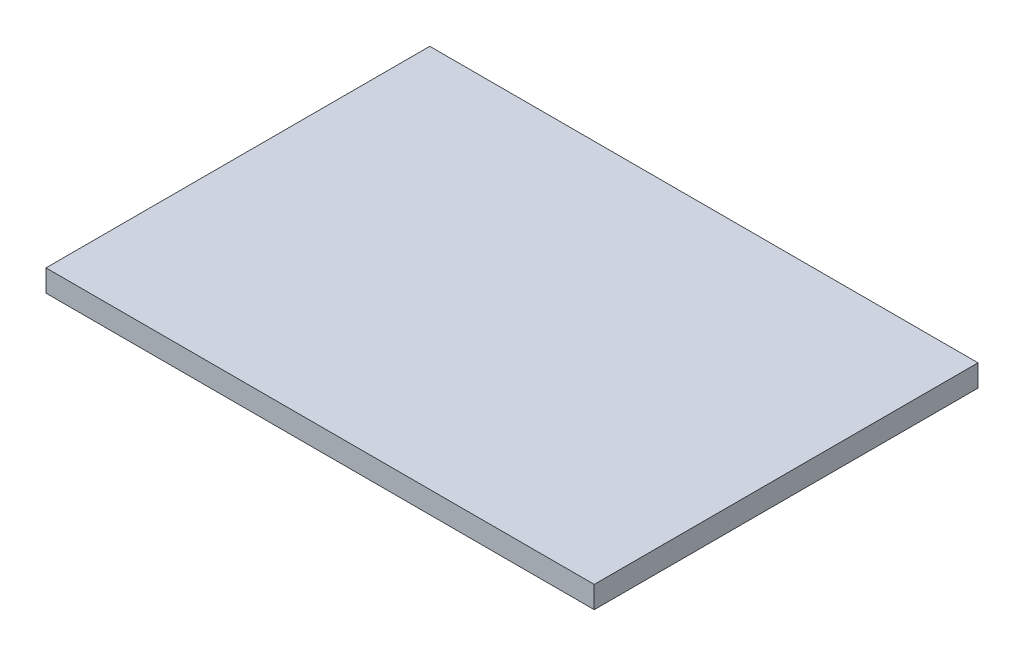
ISO-10303-21;
HEADER;
FILE_DESCRIPTION(('STEP AP214'),'2;1');
FILE_NAME('part.step','',(''),(''),'','','');
FILE_SCHEMA(('AUTOMOTIVE_DESIGN { 1 0 10303 214 1 1 1 1 }'));
ENDSEC;
DATA;
#1=APPLICATION_CONTEXT('core data for automotive mechanical design processes');
#2=APPLICATION_PROTOCOL_DEFINITION('international standard','automotive_design',2000,#1);
#3=PRODUCT_CONTEXT('',#1,'mechanical');
#4=PRODUCT('Part','Part','',(#3));
#5=PRODUCT_RELATED_PRODUCT_CATEGORY('part','',(#4));
#6=PRODUCT_DEFINITION_FORMATION('','',#4);
#7=PRODUCT_DEFINITION_CONTEXT('part definition',#1,'design');
#8=PRODUCT_DEFINITION('design','',#6,#7);
#9=PRODUCT_DEFINITION_SHAPE('','',#8);
#10=(LENGTH_UNIT() NAMED_UNIT(*) SI_UNIT(.MILLI.,.METRE.));
#11=(NAMED_UNIT(*) PLANE_ANGLE_UNIT() SI_UNIT($,.RADIAN.));
#12=(NAMED_UNIT(*) SI_UNIT($,.STERADIAN.) SOLID_ANGLE_UNIT());
#13=UNCERTAINTY_MEASURE_WITH_UNIT(LENGTH_MEASURE(1.E-05),#10,'distance_accuracy_value','');
#14=(GEOMETRIC_REPRESENTATION_CONTEXT(3) GLOBAL_UNCERTAINTY_ASSIGNED_CONTEXT((#13)) GLOBAL_UNIT_ASSIGNED_CONTEXT((#10,
#11,#12)) REPRESENTATION_CONTEXT('',''));
#15=CARTESIAN_POINT('',(0.,0.,0.));
#16=DIRECTION('',(0.,0.,1.));
#17=DIRECTION('',(1.,0.,0.));
#18=AXIS2_PLACEMENT_3D('',#15,#16,#17);
#19=CARTESIAN_POINT('',(25.,2.,17.5));
#20=DIRECTION('',(-1.,0.,0.));
#21=DIRECTION('',(0.,0.,1.));
#22=AXIS2_PLACEMENT_3D('',#19,#20,#21);
#23=PLANE('',#22);
#24=DIRECTION('',(0.,0.,-1.));
#25=VECTOR('',#24,1.);
#26=CARTESIAN_POINT('',(25.,0.,17.5));
#27=LINE('',#26,#25);
#28=CARTESIAN_POINT('',(25.,0.,17.5));
#29=VERTEX_POINT('',#28);
#30=CARTESIAN_POINT('',(25.,0.,-17.5));
#31=VERTEX_POINT('',#30);
#32=EDGE_CURVE('E107',#29,#31,#27,.T.);
#33=ORIENTED_EDGE('',*,*,#32,.T.);
#34=DIRECTION('',(0.,-1.,0.));
#35=VECTOR('',#34,1.);
#36=CARTESIAN_POINT('',(25.,2.,-17.5));
#37=LINE('',#36,#35);
#38=CARTESIAN_POINT('',(25.,2.,-17.5));
#39=VERTEX_POINT('',#38);
#40=EDGE_CURVE('E11',#39,#31,#37,.T.);
#41=ORIENTED_EDGE('',*,*,#40,.F.);
#42=DIRECTION('',(0.,0.,-1.));
#43=VECTOR('',#42,1.);
#44=CARTESIAN_POINT('',(25.,2.,17.5));
#45=LINE('',#44,#43);
#46=CARTESIAN_POINT('',(25.,2.,17.5));
#47=VERTEX_POINT('',#46);
#48=EDGE_CURVE('E91',#47,#39,#45,.T.);
#49=ORIENTED_EDGE('',*,*,#48,.F.);
#50=DIRECTION('',(0.,-1.,0.));
#51=VECTOR('',#50,1.);
#52=CARTESIAN_POINT('',(25.,2.,17.5));
#53=LINE('',#52,#51);
#54=EDGE_CURVE('E103',#47,#29,#53,.T.);
#55=ORIENTED_EDGE('',*,*,#54,.T.);
#56=EDGE_LOOP('',(#33,#41,#49,#55));
#57=FACE_BOUND('',#56,.T.);
#58=ADVANCED_FACE('F39',(#57),#23,.F.);
#59=CARTESIAN_POINT('',(-25.,2.,-17.5));
#60=DIRECTION('',(0.,0.,1.));
#61=DIRECTION('',(1.,0.,0.));
#62=AXIS2_PLACEMENT_3D('',#59,#60,#61);
#63=PLANE('',#62);
#64=DIRECTION('',(-1.,0.,0.));
#65=VECTOR('',#64,1.);
#66=CARTESIAN_POINT('',(-25.,0.,-17.5));
#67=LINE('',#66,#65);
#68=CARTESIAN_POINT('',(-25.,0.,-17.5));
#69=VERTEX_POINT('',#68);
#70=EDGE_CURVE('E96',#31,#69,#67,.T.);
#71=ORIENTED_EDGE('',*,*,#70,.T.);
#72=DIRECTION('',(0.,-1.,0.));
#73=VECTOR('',#72,1.);
#74=CARTESIAN_POINT('',(-25.,2.,-17.5));
#75=LINE('',#74,#73);
#76=CARTESIAN_POINT('',(-25.,2.,-17.5));
#77=VERTEX_POINT('',#76);
#78=EDGE_CURVE('E48',#77,#69,#75,.T.);
#79=ORIENTED_EDGE('',*,*,#78,.F.);
#80=DIRECTION('',(-1.,0.,0.));
#81=VECTOR('',#80,1.);
#82=CARTESIAN_POINT('',(-25.,2.,-17.5));
#83=LINE('',#82,#81);
#84=EDGE_CURVE('E86',#39,#77,#83,.T.);
#85=ORIENTED_EDGE('',*,*,#84,.F.);
#86=ORIENTED_EDGE('',*,*,#40,.T.);
#87=EDGE_LOOP('',(#71,#79,#85,#86));
#88=FACE_BOUND('',#87,.T.);
#89=ADVANCED_FACE('F95',(#88),#63,.F.);
#90=CARTESIAN_POINT('',(-25.,2.,17.5));
#91=DIRECTION('',(1.,0.,0.));
#92=DIRECTION('',(0.,0.,-1.));
#93=AXIS2_PLACEMENT_3D('',#90,#91,#92);
#94=PLANE('',#93);
#95=DIRECTION('',(0.,0.,1.));
#96=VECTOR('',#95,1.);
#97=CARTESIAN_POINT('',(-25.,0.,17.5));
#98=LINE('',#97,#96);
#99=CARTESIAN_POINT('',(-25.,0.,17.5));
#100=VERTEX_POINT('',#99);
#101=EDGE_CURVE('E73',#69,#100,#98,.T.);
#102=ORIENTED_EDGE('',*,*,#101,.T.);
#103=DIRECTION('',(0.,-1.,0.));
#104=VECTOR('',#103,1.);
#105=CARTESIAN_POINT('',(-25.,2.,17.5));
#106=LINE('',#105,#104);
#107=CARTESIAN_POINT('',(-25.,2.,17.5));
#108=VERTEX_POINT('',#107);
#109=EDGE_CURVE('E98',#108,#100,#106,.T.);
#110=ORIENTED_EDGE('',*,*,#109,.F.);
#111=DIRECTION('',(0.,0.,1.));
#112=VECTOR('',#111,1.);
#113=CARTESIAN_POINT('',(-25.,2.,17.5));
#114=LINE('',#113,#112);
#115=EDGE_CURVE('E89',#77,#108,#114,.T.);
#116=ORIENTED_EDGE('',*,*,#115,.F.);
#117=ORIENTED_EDGE('',*,*,#78,.T.);
#118=EDGE_LOOP('',(#102,#110,#116,#117));
#119=FACE_BOUND('',#118,.T.);
#120=ADVANCED_FACE('F99',(#119),#94,.F.);
#121=CARTESIAN_POINT('',(-25.,2.,17.5));
#122=DIRECTION('',(0.,0.,-1.));
#123=DIRECTION('',(-1.,0.,0.));
#124=AXIS2_PLACEMENT_3D('',#121,#122,#123);
#125=PLANE('',#124);
#126=DIRECTION('',(1.,0.,0.));
#127=VECTOR('',#126,1.);
#128=CARTESIAN_POINT('',(-25.,0.,17.5));
#129=LINE('',#128,#127);
#130=EDGE_CURVE('E79',#100,#29,#129,.T.);
#131=ORIENTED_EDGE('',*,*,#130,.T.);
#132=ORIENTED_EDGE('',*,*,#54,.F.);
#133=DIRECTION('',(1.,0.,0.));
#134=VECTOR('',#133,1.);
#135=CARTESIAN_POINT('',(-25.,2.,17.5));
#136=LINE('',#135,#134);
#137=EDGE_CURVE('E56',#108,#47,#136,.T.);
#138=ORIENTED_EDGE('',*,*,#137,.F.);
#139=ORIENTED_EDGE('',*,*,#109,.T.);
#140=EDGE_LOOP('',(#131,#132,#138,#139));
#141=FACE_BOUND('',#140,.T.);
#142=ADVANCED_FACE('F120',(#141),#125,.F.);
#143=CARTESIAN_POINT('',(0.,2.,0.));
#144=DIRECTION('',(0.,-1.,0.));
#145=DIRECTION('',(0.,0.,-1.));
#146=AXIS2_PLACEMENT_3D('',#143,#144,#145);
#147=PLANE('',#146);
#148=ORIENTED_EDGE('',*,*,#48,.T.);
#149=ORIENTED_EDGE('',*,*,#84,.T.);
#150=ORIENTED_EDGE('',*,*,#115,.T.);
#151=ORIENTED_EDGE('',*,*,#137,.T.);
#152=EDGE_LOOP('',(#148,#149,#150,#151));
#153=FACE_BOUND('',#152,.T.);
#154=ADVANCED_FACE('F87',(#153),#147,.F.);
#155=CARTESIAN_POINT('',(0.,0.,0.));
#156=DIRECTION('',(0.,-1.,0.));
#157=DIRECTION('',(0.,0.,-1.));
#158=AXIS2_PLACEMENT_3D('',#155,#156,#157);
#159=PLANE('',#158);
#160=ORIENTED_EDGE('',*,*,#32,.F.);
#161=ORIENTED_EDGE('',*,*,#130,.F.);
#162=ORIENTED_EDGE('',*,*,#101,.F.);
#163=ORIENTED_EDGE('',*,*,#70,.F.);
#164=EDGE_LOOP('',(#160,#161,#162,#163));
#165=FACE_BOUND('',#164,.T.);
#166=ADVANCED_FACE('F123',(#165),#159,.T.);
#167=CLOSED_SHELL('',(#58,#89,#120,#142,#154,#166));
#168=MANIFOLD_SOLID_BREP('B2',#167);
#169=ADVANCED_BREP_SHAPE_REPRESENTATION('',(#18,#168),#14);
#170=SHAPE_DEFINITION_REPRESENTATION(#9,#169);
ENDSEC;
END-ISO-10303-21;
